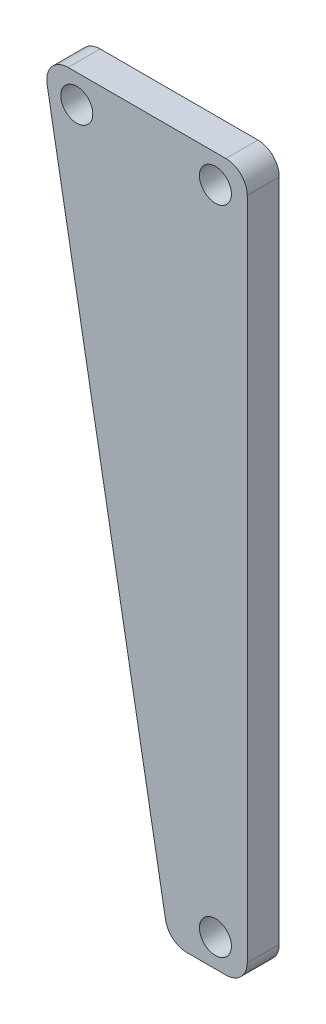
ISO-10303-21;
HEADER;
FILE_DESCRIPTION(('STEP AP214'),'2;1');
FILE_NAME('part.step','',(''),(''),'','','');
FILE_SCHEMA(('AUTOMOTIVE_DESIGN { 1 0 10303 214 1 1 1 1 }'));
ENDSEC;
DATA;
#1=APPLICATION_CONTEXT('core data for automotive mechanical design processes');
#2=APPLICATION_PROTOCOL_DEFINITION('international standard','automotive_design',2000,#1);
#3=PRODUCT_CONTEXT('',#1,'mechanical');
#4=PRODUCT('Part','Part','',(#3));
#5=PRODUCT_RELATED_PRODUCT_CATEGORY('part','',(#4));
#6=PRODUCT_DEFINITION_FORMATION('','',#4);
#7=PRODUCT_DEFINITION_CONTEXT('part definition',#1,'design');
#8=PRODUCT_DEFINITION('design','',#6,#7);
#9=PRODUCT_DEFINITION_SHAPE('','',#8);
#10=(LENGTH_UNIT() NAMED_UNIT(*) SI_UNIT(.MILLI.,.METRE.));
#11=(NAMED_UNIT(*) PLANE_ANGLE_UNIT() SI_UNIT($,.RADIAN.));
#12=(NAMED_UNIT(*) SI_UNIT($,.STERADIAN.) SOLID_ANGLE_UNIT());
#13=UNCERTAINTY_MEASURE_WITH_UNIT(LENGTH_MEASURE(1.E-05),#10,'distance_accuracy_value','');
#14=(GEOMETRIC_REPRESENTATION_CONTEXT(3) GLOBAL_UNCERTAINTY_ASSIGNED_CONTEXT((#13)) GLOBAL_UNIT_ASSIGNED_CONTEXT((#10,
#11,#12)) REPRESENTATION_CONTEXT('',''));
#15=CARTESIAN_POINT('',(0.,0.,0.));
#16=DIRECTION('',(0.,0.,1.));
#17=DIRECTION('',(1.,0.,0.));
#18=AXIS2_PLACEMENT_3D('',#15,#16,#17);
#19=CARTESIAN_POINT('',(-83.7604278797226,-492.119679425427,30.));
#20=DIRECTION('',(0.,0.,-1.));
#21=DIRECTION('',(-1.,0.,0.));
#22=AXIS2_PLACEMENT_3D('',#19,#20,#21);
#23=PLANE('',#22);
#24=CARTESIAN_POINT('',(-83.7604278797226,-492.119679425427,30.));
#25=DIRECTION('',(0.,0.,1.));
#26=DIRECTION('',(-1.,0.,0.));
#27=AXIS2_PLACEMENT_3D('',#24,#25,#26);
#28=CIRCLE('',#27,20.);
#29=CARTESIAN_POINT('',(-103.449613761692,-495.63193785915,30.));
#30=VERTEX_POINT('',#29);
#31=CARTESIAN_POINT('',(-83.7604278797226,-512.119679425427,30.));
#32=VERTEX_POINT('',#31);
#33=EDGE_CURVE('E149',#30,#32,#28,.T.);
#34=ORIENTED_EDGE('',*,*,#33,.T.);
#35=DIRECTION('',(1.,0.,0.));
#36=VECTOR('',#35,1.);
#37=CARTESIAN_POINT('',(-46.8856572465677,-512.119679425427,30.));
#38=LINE('',#37,#36);
#39=CARTESIAN_POINT('',(-46.8856572465677,-512.119679425427,30.));
#40=VERTEX_POINT('',#39);
#41=EDGE_CURVE('E97',#32,#40,#38,.T.);
#42=ORIENTED_EDGE('',*,*,#41,.T.);
#43=CARTESIAN_POINT('',(-46.8856572465677,-492.119679425427,30.));
#44=DIRECTION('',(0.,0.,1.));
#45=DIRECTION('',(-1.,0.,0.));
#46=AXIS2_PLACEMENT_3D('',#43,#44,#45);
#47=CIRCLE('',#46,20.0000000000001);
#48=CARTESIAN_POINT('',(-26.8856572465676,-492.119679425427,30.));
#49=VERTEX_POINT('',#48);
#50=EDGE_CURVE('E164',#40,#49,#47,.T.);
#51=ORIENTED_EDGE('',*,*,#50,.T.);
#52=DIRECTION('',(0.,1.,0.));
#53=VECTOR('',#52,1.);
#54=CARTESIAN_POINT('',(-26.8856572465677,130.944363815152,30.));
#55=LINE('',#54,#53);
#56=CARTESIAN_POINT('',(-26.8856572465677,130.944363815152,30.));
#57=VERTEX_POINT('',#56);
#58=EDGE_CURVE('E177',#49,#57,#55,.T.);
#59=ORIENTED_EDGE('',*,*,#58,.T.);
#60=CARTESIAN_POINT('',(-46.8856572465677,130.944363815152,30.));
#61=DIRECTION('',(0.,0.,1.));
#62=DIRECTION('',(1.,0.,0.));
#63=AXIS2_PLACEMENT_3D('',#60,#61,#62);
#64=CIRCLE('',#63,20.);
#65=CARTESIAN_POINT('',(-46.8856572465677,150.944363815152,30.));
#66=VERTEX_POINT('',#65);
#67=EDGE_CURVE('E116',#57,#66,#64,.T.);
#68=ORIENTED_EDGE('',*,*,#67,.T.);
#69=DIRECTION('',(-1.,0.,0.));
#70=VECTOR('',#69,1.);
#71=CARTESIAN_POINT('',(-194.905802489917,150.944363815152,30.));
#72=LINE('',#71,#70);
#73=CARTESIAN_POINT('',(-194.905802489917,150.944363815152,30.));
#74=VERTEX_POINT('',#73);
#75=EDGE_CURVE('E110',#66,#74,#72,.T.);
#76=ORIENTED_EDGE('',*,*,#75,.T.);
#77=CARTESIAN_POINT('',(-194.905802489917,130.944363815152,30.));
#78=DIRECTION('',(0.,0.,1.));
#79=DIRECTION('',(1.,0.,0.));
#80=AXIS2_PLACEMENT_3D('',#77,#78,#79);
#81=CIRCLE('',#80,20.);
#82=CARTESIAN_POINT('',(-214.594988371887,127.432105381429,30.));
#83=VERTEX_POINT('',#82);
#84=EDGE_CURVE('E114',#74,#83,#81,.T.);
#85=ORIENTED_EDGE('',*,*,#84,.T.);
#86=DIRECTION('',(0.175612921686147,-0.984459294098469,0.));
#87=VECTOR('',#86,1.);
#88=CARTESIAN_POINT('',(-103.449613761692,-495.63193785915,30.));
#89=LINE('',#88,#87);
#90=EDGE_CURVE('E54',#83,#30,#89,.T.);
#91=ORIENTED_EDGE('',*,*,#90,.T.);
#92=EDGE_LOOP('',(#34,#42,#51,#59,#68,#76,#85,#91));
#93=FACE_BOUND('',#92,.T.);
#94=CARTESIAN_POINT('',(-186.727272727273,124.681818181818,30.));
#95=DIRECTION('',(0.,0.,1.));
#96=DIRECTION('',(1.,0.,0.));
#97=AXIS2_PLACEMENT_3D('',#94,#95,#96);
#98=CIRCLE('',#97,15.);
#99=CARTESIAN_POINT('',(-171.727272727273,124.681818181818,30.));
#100=VERTEX_POINT('',#99);
#101=EDGE_CURVE('E138',#100,#100,#98,.T.);
#102=ORIENTED_EDGE('',*,*,#101,.F.);
#103=EDGE_LOOP('',(#102));
#104=FACE_BOUND('',#103,.T.);
#105=CARTESIAN_POINT('',(-56.7272727272727,124.681818181818,30.));
#106=DIRECTION('',(0.,0.,1.));
#107=DIRECTION('',(1.,0.,0.));
#108=AXIS2_PLACEMENT_3D('',#105,#106,#107);
#109=CIRCLE('',#108,15.);
#110=CARTESIAN_POINT('',(-41.7272727272727,124.681818181818,30.));
#111=VERTEX_POINT('',#110);
#112=EDGE_CURVE('E186',#111,#111,#109,.T.);
#113=ORIENTED_EDGE('',*,*,#112,.F.);
#114=EDGE_LOOP('',(#113));
#115=FACE_BOUND('',#114,.T.);
#116=CARTESIAN_POINT('',(-56.7272727272727,-486.118181818182,30.));
#117=DIRECTION('',(0.,0.,1.));
#118=DIRECTION('',(1.,0.,0.));
#119=AXIS2_PLACEMENT_3D('',#116,#117,#118);
#120=CIRCLE('',#119,15.);
#121=CARTESIAN_POINT('',(-41.7272727272727,-486.118181818182,30.));
#122=VERTEX_POINT('',#121);
#123=EDGE_CURVE('E192',#122,#122,#120,.T.);
#124=ORIENTED_EDGE('',*,*,#123,.F.);
#125=EDGE_LOOP('',(#124));
#126=FACE_BOUND('',#125,.T.);
#127=ADVANCED_FACE('F37',(#93,#104,#115,#126),#23,.F.);
#128=CARTESIAN_POINT('',(-83.7604278797226,-492.119679425427,0.));
#129=DIRECTION('',(0.,0.,-1.));
#130=DIRECTION('',(-1.,0.,0.));
#131=AXIS2_PLACEMENT_3D('',#128,#129,#130);
#132=PLANE('',#131);
#133=CARTESIAN_POINT('',(-56.7272727272727,124.681818181818,0.));
#134=DIRECTION('',(0.,0.,1.));
#135=DIRECTION('',(1.,0.,0.));
#136=AXIS2_PLACEMENT_3D('',#133,#134,#135);
#137=CIRCLE('',#136,15.);
#138=CARTESIAN_POINT('',(-41.7272727272727,124.681818181818,0.));
#139=VERTEX_POINT('',#138);
#140=EDGE_CURVE('E189',#139,#139,#137,.T.);
#141=ORIENTED_EDGE('',*,*,#140,.T.);
#142=EDGE_LOOP('',(#141));
#143=FACE_BOUND('',#142,.T.);
#144=CARTESIAN_POINT('',(-83.7604278797226,-492.119679425427,0.));
#145=DIRECTION('',(0.,0.,1.));
#146=DIRECTION('',(-1.,0.,0.));
#147=AXIS2_PLACEMENT_3D('',#144,#145,#146);
#148=CIRCLE('',#147,20.);
#149=CARTESIAN_POINT('',(-103.449613761692,-495.63193785915,0.));
#150=VERTEX_POINT('',#149);
#151=CARTESIAN_POINT('',(-83.7604278797226,-512.119679425427,0.));
#152=VERTEX_POINT('',#151);
#153=EDGE_CURVE('E134',#150,#152,#148,.T.);
#154=ORIENTED_EDGE('',*,*,#153,.F.);
#155=DIRECTION('',(0.175612921686147,-0.984459294098469,0.));
#156=VECTOR('',#155,1.);
#157=CARTESIAN_POINT('',(-103.449613761692,-495.63193785915,0.));
#158=LINE('',#157,#156);
#159=CARTESIAN_POINT('',(-214.594988371887,127.432105381429,0.));
#160=VERTEX_POINT('',#159);
#161=EDGE_CURVE('E89',#160,#150,#158,.T.);
#162=ORIENTED_EDGE('',*,*,#161,.F.);
#163=CARTESIAN_POINT('',(-194.905802489917,130.944363815152,0.));
#164=DIRECTION('',(0.,0.,1.));
#165=DIRECTION('',(1.,0.,0.));
#166=AXIS2_PLACEMENT_3D('',#163,#164,#165);
#167=CIRCLE('',#166,20.);
#168=CARTESIAN_POINT('',(-194.905802489917,150.944363815152,0.));
#169=VERTEX_POINT('',#168);
#170=EDGE_CURVE('E83',#169,#160,#167,.T.);
#171=ORIENTED_EDGE('',*,*,#170,.F.);
#172=DIRECTION('',(-1.,0.,0.));
#173=VECTOR('',#172,1.);
#174=CARTESIAN_POINT('',(-194.905802489917,150.944363815152,0.));
#175=LINE('',#174,#173);
#176=CARTESIAN_POINT('',(-46.8856572465677,150.944363815152,0.));
#177=VERTEX_POINT('',#176);
#178=EDGE_CURVE('E124',#177,#169,#175,.T.);
#179=ORIENTED_EDGE('',*,*,#178,.F.);
#180=CARTESIAN_POINT('',(-46.8856572465677,130.944363815152,0.));
#181=DIRECTION('',(0.,0.,1.));
#182=DIRECTION('',(1.,0.,0.));
#183=AXIS2_PLACEMENT_3D('',#180,#181,#182);
#184=CIRCLE('',#183,20.);
#185=CARTESIAN_POINT('',(-26.8856572465677,130.944363815152,0.));
#186=VERTEX_POINT('',#185);
#187=EDGE_CURVE('E144',#186,#177,#184,.T.);
#188=ORIENTED_EDGE('',*,*,#187,.F.);
#189=DIRECTION('',(0.,1.,0.));
#190=VECTOR('',#189,1.);
#191=CARTESIAN_POINT('',(-26.8856572465677,130.944363815152,0.));
#192=LINE('',#191,#190);
#193=CARTESIAN_POINT('',(-26.8856572465676,-492.119679425427,0.));
#194=VERTEX_POINT('',#193);
#195=EDGE_CURVE('E142',#194,#186,#192,.T.);
#196=ORIENTED_EDGE('',*,*,#195,.F.);
#197=CARTESIAN_POINT('',(-46.8856572465677,-492.119679425427,0.));
#198=DIRECTION('',(0.,0.,1.));
#199=DIRECTION('',(-1.,0.,0.));
#200=AXIS2_PLACEMENT_3D('',#197,#198,#199);
#201=CIRCLE('',#200,20.0000000000001);
#202=CARTESIAN_POINT('',(-46.8856572465677,-512.119679425427,0.));
#203=VERTEX_POINT('',#202);
#204=EDGE_CURVE('E140',#203,#194,#201,.T.);
#205=ORIENTED_EDGE('',*,*,#204,.F.);
#206=DIRECTION('',(1.,0.,0.));
#207=VECTOR('',#206,1.);
#208=CARTESIAN_POINT('',(-46.8856572465677,-512.119679425427,0.));
#209=LINE('',#208,#207);
#210=EDGE_CURVE('E137',#152,#203,#209,.T.);
#211=ORIENTED_EDGE('',*,*,#210,.F.);
#212=EDGE_LOOP('',(#154,#162,#171,#179,#188,#196,#205,#211));
#213=FACE_BOUND('',#212,.T.);
#214=CARTESIAN_POINT('',(-186.727272727273,124.681818181818,0.));
#215=DIRECTION('',(0.,0.,1.));
#216=DIRECTION('',(1.,0.,0.));
#217=AXIS2_PLACEMENT_3D('',#214,#215,#216);
#218=CIRCLE('',#217,15.);
#219=CARTESIAN_POINT('',(-171.727272727273,124.681818181818,0.));
#220=VERTEX_POINT('',#219);
#221=EDGE_CURVE('E183',#220,#220,#218,.T.);
#222=ORIENTED_EDGE('',*,*,#221,.T.);
#223=EDGE_LOOP('',(#222));
#224=FACE_BOUND('',#223,.T.);
#225=CARTESIAN_POINT('',(-56.7272727272727,-486.118181818182,0.));
#226=DIRECTION('',(0.,0.,1.));
#227=DIRECTION('',(1.,0.,0.));
#228=AXIS2_PLACEMENT_3D('',#225,#226,#227);
#229=CIRCLE('',#228,15.);
#230=CARTESIAN_POINT('',(-41.7272727272727,-486.118181818182,0.));
#231=VERTEX_POINT('',#230);
#232=EDGE_CURVE('E195',#231,#231,#229,.T.);
#233=ORIENTED_EDGE('',*,*,#232,.T.);
#234=EDGE_LOOP('',(#233));
#235=FACE_BOUND('',#234,.T.);
#236=ADVANCED_FACE('F168',(#143,#213,#224,#235),#132,.T.);
#237=CARTESIAN_POINT('',(-83.7604278797226,-492.119679425427,30.));
#238=DIRECTION('',(0.,0.,-1.));
#239=DIRECTION('',(-1.,0.,0.));
#240=AXIS2_PLACEMENT_3D('',#237,#238,#239);
#241=CYLINDRICAL_SURFACE('',#240,20.);
#242=ORIENTED_EDGE('',*,*,#153,.T.);
#243=DIRECTION('',(0.,0.,-1.));
#244=VECTOR('',#243,1.);
#245=CARTESIAN_POINT('',(-83.7604278797226,-512.119679425427,30.));
#246=LINE('',#245,#244);
#247=EDGE_CURVE('E11',#32,#152,#246,.T.);
#248=ORIENTED_EDGE('',*,*,#247,.F.);
#249=ORIENTED_EDGE('',*,*,#33,.F.);
#250=DIRECTION('',(0.,0.,-1.));
#251=VECTOR('',#250,1.);
#252=CARTESIAN_POINT('',(-103.449613761692,-495.63193785915,30.));
#253=LINE('',#252,#251);
#254=EDGE_CURVE('E130',#30,#150,#253,.T.);
#255=ORIENTED_EDGE('',*,*,#254,.T.);
#256=EDGE_LOOP('',(#242,#248,#249,#255));
#257=FACE_BOUND('',#256,.T.);
#258=ADVANCED_FACE('F39',(#257),#241,.T.);
#259=CARTESIAN_POINT('',(-46.8856572465677,-512.119679425427,30.));
#260=DIRECTION('',(0.,1.,0.));
#261=DIRECTION('',(-1.,0.,0.));
#262=AXIS2_PLACEMENT_3D('',#259,#260,#261);
#263=PLANE('',#262);
#264=ORIENTED_EDGE('',*,*,#210,.T.);
#265=DIRECTION('',(0.,0.,-1.));
#266=VECTOR('',#265,1.);
#267=CARTESIAN_POINT('',(-46.8856572465677,-512.119679425427,30.));
#268=LINE('',#267,#266);
#269=EDGE_CURVE('E46',#40,#203,#268,.T.);
#270=ORIENTED_EDGE('',*,*,#269,.F.);
#271=ORIENTED_EDGE('',*,*,#41,.F.);
#272=ORIENTED_EDGE('',*,*,#247,.T.);
#273=EDGE_LOOP('',(#264,#270,#271,#272));
#274=FACE_BOUND('',#273,.T.);
#275=ADVANCED_FACE('F227',(#274),#263,.F.);
#276=CARTESIAN_POINT('',(-46.8856572465677,-492.119679425427,30.));
#277=DIRECTION('',(0.,0.,-1.));
#278=DIRECTION('',(-1.,0.,0.));
#279=AXIS2_PLACEMENT_3D('',#276,#277,#278);
#280=CYLINDRICAL_SURFACE('',#279,20.0000000000001);
#281=ORIENTED_EDGE('',*,*,#204,.T.);
#282=DIRECTION('',(0.,0.,-1.));
#283=VECTOR('',#282,1.);
#284=CARTESIAN_POINT('',(-26.8856572465676,-492.119679425427,30.));
#285=LINE('',#284,#283);
#286=EDGE_CURVE('E156',#49,#194,#285,.T.);
#287=ORIENTED_EDGE('',*,*,#286,.F.);
#288=ORIENTED_EDGE('',*,*,#50,.F.);
#289=ORIENTED_EDGE('',*,*,#269,.T.);
#290=EDGE_LOOP('',(#281,#287,#288,#289));
#291=FACE_BOUND('',#290,.T.);
#292=ADVANCED_FACE('F162',(#291),#280,.T.);
#293=CARTESIAN_POINT('',(-26.8856572465677,130.944363815152,30.));
#294=DIRECTION('',(-1.,0.,0.));
#295=DIRECTION('',(0.,0.,1.));
#296=AXIS2_PLACEMENT_3D('',#293,#294,#295);
#297=PLANE('',#296);
#298=ORIENTED_EDGE('',*,*,#195,.T.);
#299=DIRECTION('',(0.,0.,-1.));
#300=VECTOR('',#299,1.);
#301=CARTESIAN_POINT('',(-26.8856572465677,130.944363815152,30.));
#302=LINE('',#301,#300);
#303=EDGE_CURVE('E153',#57,#186,#302,.T.);
#304=ORIENTED_EDGE('',*,*,#303,.F.);
#305=ORIENTED_EDGE('',*,*,#58,.F.);
#306=ORIENTED_EDGE('',*,*,#286,.T.);
#307=EDGE_LOOP('',(#298,#304,#305,#306));
#308=FACE_BOUND('',#307,.T.);
#309=ADVANCED_FACE('F173',(#308),#297,.F.);
#310=CARTESIAN_POINT('',(-46.8856572465677,130.944363815152,30.));
#311=DIRECTION('',(0.,0.,-1.));
#312=DIRECTION('',(-1.,0.,0.));
#313=AXIS2_PLACEMENT_3D('',#310,#311,#312);
#314=CYLINDRICAL_SURFACE('',#313,20.);
#315=ORIENTED_EDGE('',*,*,#187,.T.);
#316=DIRECTION('',(0.,0.,-1.));
#317=VECTOR('',#316,1.);
#318=CARTESIAN_POINT('',(-46.8856572465677,150.944363815152,30.));
#319=LINE('',#318,#317);
#320=EDGE_CURVE('E125',#66,#177,#319,.T.);
#321=ORIENTED_EDGE('',*,*,#320,.F.);
#322=ORIENTED_EDGE('',*,*,#67,.F.);
#323=ORIENTED_EDGE('',*,*,#303,.T.);
#324=EDGE_LOOP('',(#315,#321,#322,#323));
#325=FACE_BOUND('',#324,.T.);
#326=ADVANCED_FACE('F176',(#325),#314,.T.);
#327=CARTESIAN_POINT('',(-194.905802489917,150.944363815152,30.));
#328=DIRECTION('',(0.,-1.,0.));
#329=DIRECTION('',(0.,0.,-1.));
#330=AXIS2_PLACEMENT_3D('',#327,#328,#329);
#331=PLANE('',#330);
#332=ORIENTED_EDGE('',*,*,#178,.T.);
#333=DIRECTION('',(0.,0.,-1.));
#334=VECTOR('',#333,1.);
#335=CARTESIAN_POINT('',(-194.905802489917,150.944363815152,30.));
#336=LINE('',#335,#334);
#337=EDGE_CURVE('E121',#74,#169,#336,.T.);
#338=ORIENTED_EDGE('',*,*,#337,.F.);
#339=ORIENTED_EDGE('',*,*,#75,.F.);
#340=ORIENTED_EDGE('',*,*,#320,.T.);
#341=EDGE_LOOP('',(#332,#338,#339,#340));
#342=FACE_BOUND('',#341,.T.);
#343=ADVANCED_FACE('F122',(#342),#331,.F.);
#344=CARTESIAN_POINT('',(-194.905802489917,130.944363815152,30.));
#345=DIRECTION('',(0.,0.,-1.));
#346=DIRECTION('',(-1.,0.,0.));
#347=AXIS2_PLACEMENT_3D('',#344,#345,#346);
#348=CYLINDRICAL_SURFACE('',#347,20.);
#349=ORIENTED_EDGE('',*,*,#170,.T.);
#350=DIRECTION('',(0.,0.,-1.));
#351=VECTOR('',#350,1.);
#352=CARTESIAN_POINT('',(-214.594988371887,127.432105381429,30.));
#353=LINE('',#352,#351);
#354=EDGE_CURVE('E126',#83,#160,#353,.T.);
#355=ORIENTED_EDGE('',*,*,#354,.F.);
#356=ORIENTED_EDGE('',*,*,#84,.F.);
#357=ORIENTED_EDGE('',*,*,#337,.T.);
#358=EDGE_LOOP('',(#349,#355,#356,#357));
#359=FACE_BOUND('',#358,.T.);
#360=ADVANCED_FACE('F128',(#359),#348,.T.);
#361=CARTESIAN_POINT('',(-103.449613761692,-495.63193785915,30.));
#362=DIRECTION('',(0.984459294098469,0.175612921686147,0.));
#363=DIRECTION('',(-0.175612921686148,0.984459294098469,0.));
#364=AXIS2_PLACEMENT_3D('',#361,#362,#363);
#365=PLANE('',#364);
#366=ORIENTED_EDGE('',*,*,#161,.T.);
#367=ORIENTED_EDGE('',*,*,#254,.F.);
#368=ORIENTED_EDGE('',*,*,#90,.F.);
#369=ORIENTED_EDGE('',*,*,#354,.T.);
#370=EDGE_LOOP('',(#366,#367,#368,#369));
#371=FACE_BOUND('',#370,.T.);
#372=ADVANCED_FACE('F215',(#371),#365,.F.);
#373=CARTESIAN_POINT('',(-186.727272727273,124.681818181818,30.));
#374=DIRECTION('',(0.,0.,-1.));
#375=DIRECTION('',(-1.,0.,0.));
#376=AXIS2_PLACEMENT_3D('',#373,#374,#375);
#377=CYLINDRICAL_SURFACE('',#376,15.);
#378=ORIENTED_EDGE('',*,*,#101,.T.);
#379=EDGE_LOOP('',(#378));
#380=FACE_BOUND('',#379,.T.);
#381=ORIENTED_EDGE('',*,*,#221,.F.);
#382=EDGE_LOOP('',(#381));
#383=FACE_BOUND('',#382,.T.);
#384=ADVANCED_FACE('F212',(#380,#383),#377,.F.);
#385=CARTESIAN_POINT('',(-56.7272727272727,124.681818181818,30.));
#386=DIRECTION('',(0.,0.,-1.));
#387=DIRECTION('',(-1.,0.,0.));
#388=AXIS2_PLACEMENT_3D('',#385,#386,#387);
#389=CYLINDRICAL_SURFACE('',#388,15.);
#390=ORIENTED_EDGE('',*,*,#112,.T.);
#391=EDGE_LOOP('',(#390));
#392=FACE_BOUND('',#391,.T.);
#393=ORIENTED_EDGE('',*,*,#140,.F.);
#394=EDGE_LOOP('',(#393));
#395=FACE_BOUND('',#394,.T.);
#396=ADVANCED_FACE('F303',(#392,#395),#389,.F.);
#397=CARTESIAN_POINT('',(-56.7272727272727,-486.118181818182,30.));
#398=DIRECTION('',(0.,0.,-1.));
#399=DIRECTION('',(-1.,0.,0.));
#400=AXIS2_PLACEMENT_3D('',#397,#398,#399);
#401=CYLINDRICAL_SURFACE('',#400,15.);
#402=ORIENTED_EDGE('',*,*,#123,.T.);
#403=EDGE_LOOP('',(#402));
#404=FACE_BOUND('',#403,.T.);
#405=ORIENTED_EDGE('',*,*,#232,.F.);
#406=EDGE_LOOP('',(#405));
#407=FACE_BOUND('',#406,.T.);
#408=ADVANCED_FACE('F201',(#404,#407),#401,.F.);
#409=CLOSED_SHELL('',(#127,#236,#258,#275,#292,#309,#326,#343,#360,#372,#384,#396,#408));
#410=MANIFOLD_SOLID_BREP('B2',#409);
#411=ADVANCED_BREP_SHAPE_REPRESENTATION('',(#18,#410),#14);
#412=SHAPE_DEFINITION_REPRESENTATION(#9,#411);
ENDSEC;
END-ISO-10303-21;
